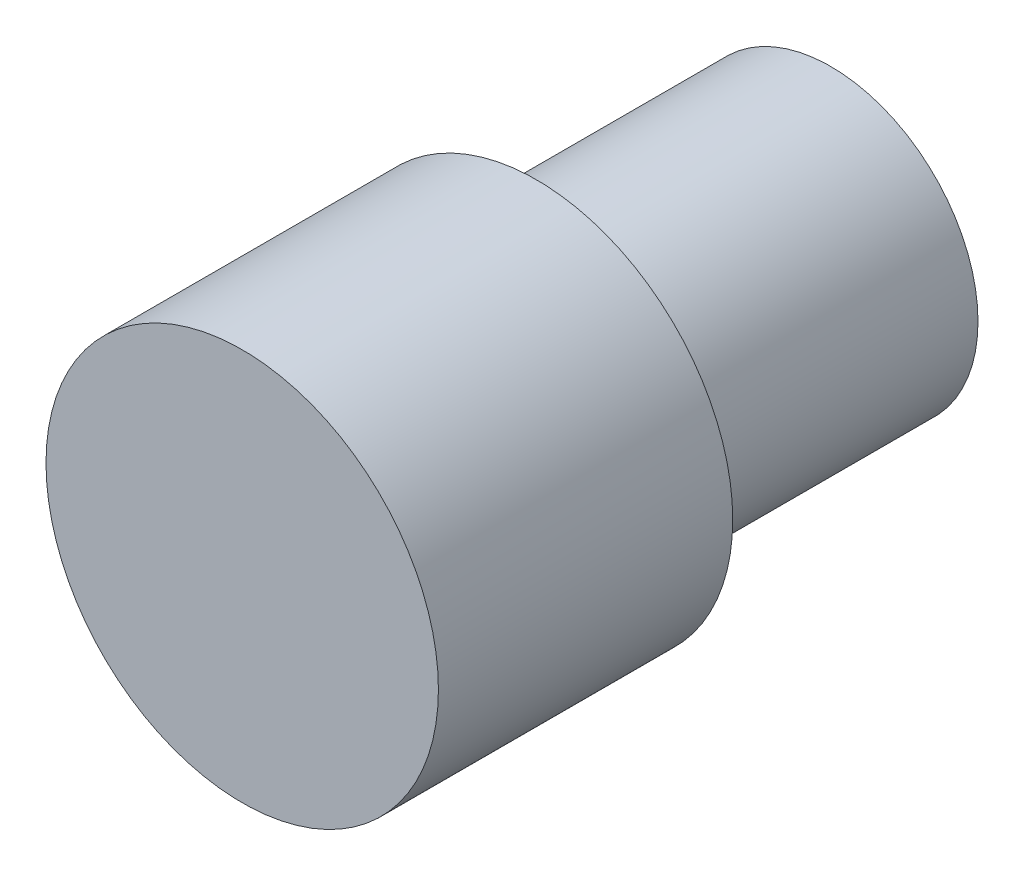
ISO-10303-21;
HEADER;
FILE_DESCRIPTION(('STEP AP214'),'2;1');
FILE_NAME('part.step','',(''),(''),'','','');
FILE_SCHEMA(('AUTOMOTIVE_DESIGN { 1 0 10303 214 1 1 1 1 }'));
ENDSEC;
DATA;
#1=APPLICATION_CONTEXT('core data for automotive mechanical design processes');
#2=APPLICATION_PROTOCOL_DEFINITION('international standard','automotive_design',2000,#1);
#3=PRODUCT_CONTEXT('',#1,'mechanical');
#4=PRODUCT('Part','Part','',(#3));
#5=PRODUCT_RELATED_PRODUCT_CATEGORY('part','',(#4));
#6=PRODUCT_DEFINITION_FORMATION('','',#4);
#7=PRODUCT_DEFINITION_CONTEXT('part definition',#1,'design');
#8=PRODUCT_DEFINITION('design','',#6,#7);
#9=PRODUCT_DEFINITION_SHAPE('','',#8);
#10=(LENGTH_UNIT() NAMED_UNIT(*) SI_UNIT(.MILLI.,.METRE.));
#11=(NAMED_UNIT(*) PLANE_ANGLE_UNIT() SI_UNIT($,.RADIAN.));
#12=(NAMED_UNIT(*) SI_UNIT($,.STERADIAN.) SOLID_ANGLE_UNIT());
#13=UNCERTAINTY_MEASURE_WITH_UNIT(LENGTH_MEASURE(1.E-05),#10,'distance_accuracy_value','');
#14=(GEOMETRIC_REPRESENTATION_CONTEXT(3) GLOBAL_UNCERTAINTY_ASSIGNED_CONTEXT((#13)) GLOBAL_UNIT_ASSIGNED_CONTEXT((#10,
#11,#12)) REPRESENTATION_CONTEXT('',''));
#15=CARTESIAN_POINT('',(0.,0.,0.));
#16=DIRECTION('',(0.,0.,1.));
#17=DIRECTION('',(1.,0.,0.));
#18=AXIS2_PLACEMENT_3D('',#15,#16,#17);
#19=CARTESIAN_POINT('',(0.,0.,15.));
#20=DIRECTION('',(0.,0.,-1.));
#21=DIRECTION('',(-1.,0.,0.));
#22=AXIS2_PLACEMENT_3D('',#19,#20,#21);
#23=CYLINDRICAL_SURFACE('',#22,7.5);
#24=CARTESIAN_POINT('',(0.,0.,15.));
#25=DIRECTION('',(0.,0.,1.));
#26=DIRECTION('',(1.,0.,0.));
#27=AXIS2_PLACEMENT_3D('',#24,#25,#26);
#28=CIRCLE('',#27,7.5);
#29=CARTESIAN_POINT('',(7.5,0.,15.));
#30=VERTEX_POINT('',#29);
#31=EDGE_CURVE('E10',#30,#30,#28,.T.);
#32=ORIENTED_EDGE('',*,*,#31,.F.);
#33=EDGE_LOOP('',(#32));
#34=FACE_BOUND('',#33,.T.);
#35=CARTESIAN_POINT('',(0.,0.,0.));
#36=DIRECTION('',(0.,0.,1.));
#37=DIRECTION('',(1.,0.,0.));
#38=AXIS2_PLACEMENT_3D('',#35,#36,#37);
#39=CIRCLE('',#38,7.5);
#40=CARTESIAN_POINT('',(7.5,0.,0.));
#41=VERTEX_POINT('',#40);
#42=EDGE_CURVE('E38',#41,#41,#39,.T.);
#43=ORIENTED_EDGE('',*,*,#42,.T.);
#44=EDGE_LOOP('',(#43));
#45=FACE_BOUND('',#44,.T.);
#46=ADVANCED_FACE('F35',(#34,#45),#23,.T.);
#47=CARTESIAN_POINT('',(0.,0.,0.));
#48=DIRECTION('',(0.,0.,1.));
#49=DIRECTION('',(1.,0.,0.));
#50=AXIS2_PLACEMENT_3D('',#47,#48,#49);
#51=PLANE('',#50);
#52=ORIENTED_EDGE('',*,*,#42,.F.);
#53=EDGE_LOOP('',(#52));
#54=FACE_BOUND('',#53,.T.);
#55=ADVANCED_FACE('F58',(#54),#51,.F.);
#56=CARTESIAN_POINT('',(0.,0.,30.));
#57=DIRECTION('',(0.,0.,-1.));
#58=DIRECTION('',(-1.,0.,0.));
#59=AXIS2_PLACEMENT_3D('',#56,#57,#58);
#60=CYLINDRICAL_SURFACE('',#59,10.);
#61=CARTESIAN_POINT('',(0.,0.,30.));
#62=DIRECTION('',(0.,0.,1.));
#63=DIRECTION('',(1.,0.,0.));
#64=AXIS2_PLACEMENT_3D('',#61,#62,#63);
#65=CIRCLE('',#64,10.);
#66=CARTESIAN_POINT('',(10.,0.,30.));
#67=VERTEX_POINT('',#66);
#68=EDGE_CURVE('E45',#67,#67,#65,.T.);
#69=ORIENTED_EDGE('',*,*,#68,.F.);
#70=EDGE_LOOP('',(#69));
#71=FACE_BOUND('',#70,.T.);
#72=CARTESIAN_POINT('',(0.,0.,15.));
#73=DIRECTION('',(0.,0.,1.));
#74=DIRECTION('',(1.,0.,0.));
#75=AXIS2_PLACEMENT_3D('',#72,#73,#74);
#76=CIRCLE('',#75,10.);
#77=CARTESIAN_POINT('',(10.,0.,15.));
#78=VERTEX_POINT('',#77);
#79=EDGE_CURVE('E47',#78,#78,#76,.T.);
#80=ORIENTED_EDGE('',*,*,#79,.T.);
#81=EDGE_LOOP('',(#80));
#82=FACE_BOUND('',#81,.T.);
#83=ADVANCED_FACE('F55',(#71,#82),#60,.T.);
#84=CARTESIAN_POINT('',(0.,0.,30.));
#85=DIRECTION('',(0.,0.,1.));
#86=DIRECTION('',(1.,0.,0.));
#87=AXIS2_PLACEMENT_3D('',#84,#85,#86);
#88=PLANE('',#87);
#89=ORIENTED_EDGE('',*,*,#68,.T.);
#90=EDGE_LOOP('',(#89));
#91=FACE_BOUND('',#90,.T.);
#92=ADVANCED_FACE('F53',(#91),#88,.T.);
#93=CARTESIAN_POINT('',(0.,0.,15.));
#94=DIRECTION('',(0.,0.,1.));
#95=DIRECTION('',(1.,0.,0.));
#96=AXIS2_PLACEMENT_3D('',#93,#94,#95);
#97=PLANE('',#96);
#98=ORIENTED_EDGE('',*,*,#31,.T.);
#99=EDGE_LOOP('',(#98));
#100=FACE_BOUND('',#99,.T.);
#101=ORIENTED_EDGE('',*,*,#79,.F.);
#102=EDGE_LOOP('',(#101));
#103=FACE_BOUND('',#102,.T.);
#104=ADVANCED_FACE('F62',(#100,#103),#97,.F.);
#105=CLOSED_SHELL('',(#46,#55,#83,#92,#104));
#106=MANIFOLD_SOLID_BREP('B2',#105);
#107=ADVANCED_BREP_SHAPE_REPRESENTATION('',(#18,#106),#14);
#108=SHAPE_DEFINITION_REPRESENTATION(#9,#107);
ENDSEC;
END-ISO-10303-21;
